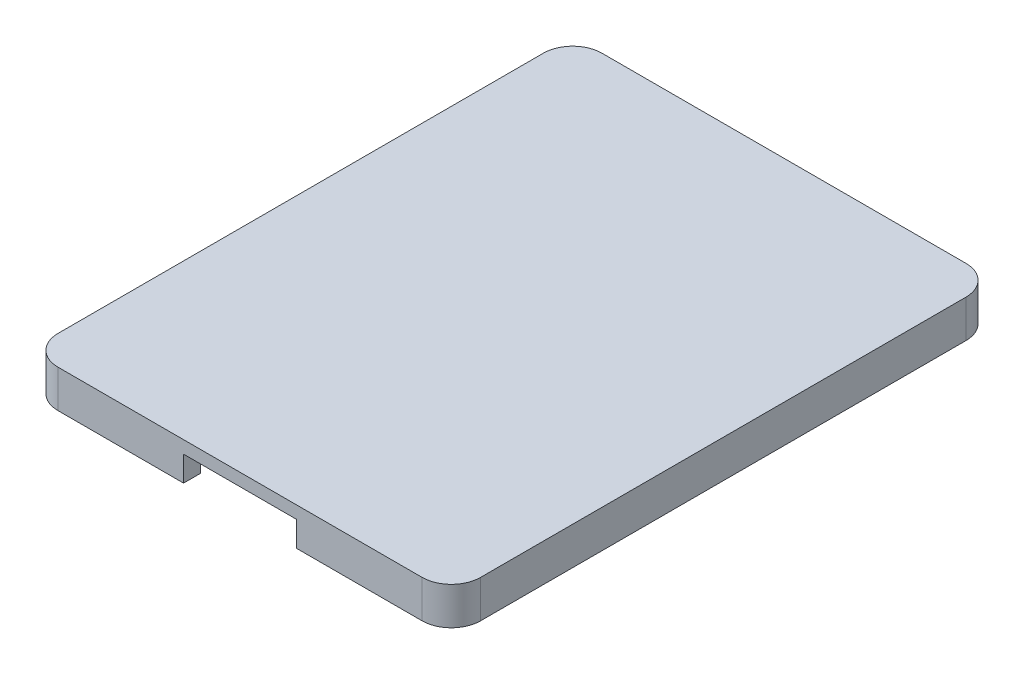
ISO-10303-21;
HEADER;
FILE_DESCRIPTION(('STEP AP214'),'2;1');
FILE_NAME('part.step','',(''),(''),'','','');
FILE_SCHEMA(('AUTOMOTIVE_DESIGN { 1 0 10303 214 1 1 1 1 }'));
ENDSEC;
DATA;
#1=APPLICATION_CONTEXT('core data for automotive mechanical design processes');
#2=APPLICATION_PROTOCOL_DEFINITION('international standard','automotive_design',2000,#1);
#3=PRODUCT_CONTEXT('',#1,'mechanical');
#4=PRODUCT('Part','Part','',(#3));
#5=PRODUCT_RELATED_PRODUCT_CATEGORY('part','',(#4));
#6=PRODUCT_DEFINITION_FORMATION('','',#4);
#7=PRODUCT_DEFINITION_CONTEXT('part definition',#1,'design');
#8=PRODUCT_DEFINITION('design','',#6,#7);
#9=PRODUCT_DEFINITION_SHAPE('','',#8);
#10=(LENGTH_UNIT() NAMED_UNIT(*) SI_UNIT(.MILLI.,.METRE.));
#11=(NAMED_UNIT(*) PLANE_ANGLE_UNIT() SI_UNIT($,.RADIAN.));
#12=(NAMED_UNIT(*) SI_UNIT($,.STERADIAN.) SOLID_ANGLE_UNIT());
#13=UNCERTAINTY_MEASURE_WITH_UNIT(LENGTH_MEASURE(1.E-05),#10,'distance_accuracy_value','');
#14=(GEOMETRIC_REPRESENTATION_CONTEXT(3) GLOBAL_UNCERTAINTY_ASSIGNED_CONTEXT((#13)) GLOBAL_UNIT_ASSIGNED_CONTEXT((#10,
#11,#12)) REPRESENTATION_CONTEXT('',''));
#15=CARTESIAN_POINT('',(0.,0.,0.));
#16=DIRECTION('',(0.,0.,1.));
#17=DIRECTION('',(1.,0.,0.));
#18=AXIS2_PLACEMENT_3D('',#15,#16,#17);
#19=CARTESIAN_POINT('',(-21.75,4.5,29.));
#20=DIRECTION('',(0.,-1.,0.));
#21=DIRECTION('',(0.,0.,-1.));
#22=AXIS2_PLACEMENT_3D('',#19,#20,#21);
#23=CYLINDRICAL_SURFACE('',#22,3.5);
#24=CARTESIAN_POINT('',(-21.75,0.,29.));
#25=DIRECTION('',(0.,1.,0.));
#26=DIRECTION('',(0.,0.,-1.));
#27=AXIS2_PLACEMENT_3D('',#24,#25,#26);
#28=CIRCLE('',#27,3.5);
#29=CARTESIAN_POINT('',(-25.25,0.,29.));
#30=VERTEX_POINT('',#29);
#31=CARTESIAN_POINT('',(-21.75,0.,32.5));
#32=VERTEX_POINT('',#31);
#33=EDGE_CURVE('E245',#30,#32,#28,.T.);
#34=ORIENTED_EDGE('',*,*,#33,.T.);
#35=DIRECTION('',(0.,-1.,0.));
#36=VECTOR('',#35,1.);
#37=CARTESIAN_POINT('',(-21.75,4.5,32.5));
#38=LINE('',#37,#36);
#39=CARTESIAN_POINT('',(-21.75,4.5,32.5));
#40=VERTEX_POINT('',#39);
#41=EDGE_CURVE('E315',#40,#32,#38,.T.);
#42=ORIENTED_EDGE('',*,*,#41,.F.);
#43=CARTESIAN_POINT('',(-21.75,4.5,29.));
#44=DIRECTION('',(0.,1.,0.));
#45=DIRECTION('',(0.,0.,-1.));
#46=AXIS2_PLACEMENT_3D('',#43,#44,#45);
#47=CIRCLE('',#46,3.5);
#48=CARTESIAN_POINT('',(-25.25,4.5,29.));
#49=VERTEX_POINT('',#48);
#50=EDGE_CURVE('E260',#49,#40,#47,.T.);
#51=ORIENTED_EDGE('',*,*,#50,.F.);
#52=DIRECTION('',(0.,-1.,0.));
#53=VECTOR('',#52,1.);
#54=CARTESIAN_POINT('',(-25.25,4.5,29.));
#55=LINE('',#54,#53);
#56=EDGE_CURVE('E278',#49,#30,#55,.T.);
#57=ORIENTED_EDGE('',*,*,#56,.T.);
#58=EDGE_LOOP('',(#34,#42,#51,#57));
#59=FACE_BOUND('',#58,.T.);
#60=ADVANCED_FACE('F33',(#59),#23,.T.);
#61=CARTESIAN_POINT('',(-21.75,4.5,32.5));
#62=DIRECTION('',(0.,0.,-1.));
#63=DIRECTION('',(-1.,0.,0.));
#64=AXIS2_PLACEMENT_3D('',#61,#62,#63);
#65=PLANE('',#64);
#66=DIRECTION('',(-1.,0.,0.));
#67=VECTOR('',#66,1.);
#68=CARTESIAN_POINT('',(-6.75,3.,32.5));
#69=LINE('',#68,#67);
#70=CARTESIAN_POINT('',(6.75,3.,32.5));
#71=VERTEX_POINT('',#70);
#72=CARTESIAN_POINT('',(-6.75,3.,32.5));
#73=VERTEX_POINT('',#72);
#74=EDGE_CURVE('E178',#71,#73,#69,.T.);
#75=ORIENTED_EDGE('',*,*,#74,.F.);
#76=DIRECTION('',(0.,1.,0.));
#77=VECTOR('',#76,1.);
#78=CARTESIAN_POINT('',(6.75,3.,32.5));
#79=LINE('',#78,#77);
#80=CARTESIAN_POINT('',(6.75,0.,32.5));
#81=VERTEX_POINT('',#80);
#82=EDGE_CURVE('E169',#81,#71,#79,.T.);
#83=ORIENTED_EDGE('',*,*,#82,.F.);
#84=DIRECTION('',(1.,0.,0.));
#85=VECTOR('',#84,1.);
#86=CARTESIAN_POINT('',(-21.75,0.,32.5));
#87=LINE('',#86,#85);
#88=CARTESIAN_POINT('',(21.75,0.,32.5));
#89=VERTEX_POINT('',#88);
#90=EDGE_CURVE('E281',#81,#89,#87,.T.);
#91=ORIENTED_EDGE('',*,*,#90,.T.);
#92=DIRECTION('',(0.,-1.,0.));
#93=VECTOR('',#92,1.);
#94=CARTESIAN_POINT('',(21.75,4.5,32.5));
#95=LINE('',#94,#93);
#96=CARTESIAN_POINT('',(21.75,4.5,32.5));
#97=VERTEX_POINT('',#96);
#98=EDGE_CURVE('E312',#97,#89,#95,.T.);
#99=ORIENTED_EDGE('',*,*,#98,.F.);
#100=DIRECTION('',(1.,0.,0.));
#101=VECTOR('',#100,1.);
#102=CARTESIAN_POINT('',(-21.75,4.5,32.5));
#103=LINE('',#102,#101);
#104=EDGE_CURVE('E263',#40,#97,#103,.T.);
#105=ORIENTED_EDGE('',*,*,#104,.F.);
#106=ORIENTED_EDGE('',*,*,#41,.T.);
#107=CARTESIAN_POINT('',(-6.75,0.,32.5));
#108=VERTEX_POINT('',#107);
#109=EDGE_CURVE('E282',#32,#108,#87,.T.);
#110=ORIENTED_EDGE('',*,*,#109,.T.);
#111=DIRECTION('',(0.,-1.,0.));
#112=VECTOR('',#111,1.);
#113=CARTESIAN_POINT('',(-6.75,3.,32.5));
#114=LINE('',#113,#112);
#115=EDGE_CURVE('E184',#73,#108,#114,.T.);
#116=ORIENTED_EDGE('',*,*,#115,.F.);
#117=EDGE_LOOP('',(#75,#83,#91,#99,#105,#106,#110,#116));
#118=FACE_BOUND('',#117,.T.);
#119=ADVANCED_FACE('F186',(#118),#65,.F.);
#120=CARTESIAN_POINT('',(21.75,4.5,29.));
#121=DIRECTION('',(0.,-1.,0.));
#122=DIRECTION('',(0.,0.,-1.));
#123=AXIS2_PLACEMENT_3D('',#120,#121,#122);
#124=CYLINDRICAL_SURFACE('',#123,3.5);
#125=CARTESIAN_POINT('',(21.75,0.,29.));
#126=DIRECTION('',(0.,1.,0.));
#127=DIRECTION('',(0.,0.,1.));
#128=AXIS2_PLACEMENT_3D('',#125,#126,#127);
#129=CIRCLE('',#128,3.5);
#130=CARTESIAN_POINT('',(25.25,0.,29.));
#131=VERTEX_POINT('',#130);
#132=EDGE_CURVE('E284',#89,#131,#129,.T.);
#133=ORIENTED_EDGE('',*,*,#132,.T.);
#134=DIRECTION('',(0.,-1.,0.));
#135=VECTOR('',#134,1.);
#136=CARTESIAN_POINT('',(25.25,4.5,29.));
#137=LINE('',#136,#135);
#138=CARTESIAN_POINT('',(25.25,4.5,29.));
#139=VERTEX_POINT('',#138);
#140=EDGE_CURVE('E309',#139,#131,#137,.T.);
#141=ORIENTED_EDGE('',*,*,#140,.F.);
#142=CARTESIAN_POINT('',(21.75,4.5,29.));
#143=DIRECTION('',(0.,1.,0.));
#144=DIRECTION('',(0.,0.,1.));
#145=AXIS2_PLACEMENT_3D('',#142,#143,#144);
#146=CIRCLE('',#145,3.5);
#147=EDGE_CURVE('E266',#97,#139,#146,.T.);
#148=ORIENTED_EDGE('',*,*,#147,.F.);
#149=ORIENTED_EDGE('',*,*,#98,.T.);
#150=EDGE_LOOP('',(#133,#141,#148,#149));
#151=FACE_BOUND('',#150,.T.);
#152=ADVANCED_FACE('F348',(#151),#124,.T.);
#153=CARTESIAN_POINT('',(25.25,4.5,29.));
#154=DIRECTION('',(-1.,0.,0.));
#155=DIRECTION('',(0.,0.,1.));
#156=AXIS2_PLACEMENT_3D('',#153,#154,#155);
#157=PLANE('',#156);
#158=DIRECTION('',(0.,0.,-1.));
#159=VECTOR('',#158,1.);
#160=CARTESIAN_POINT('',(25.25,0.,29.));
#161=LINE('',#160,#159);
#162=CARTESIAN_POINT('',(25.25,0.,-29.));
#163=VERTEX_POINT('',#162);
#164=EDGE_CURVE('E286',#131,#163,#161,.T.);
#165=ORIENTED_EDGE('',*,*,#164,.T.);
#166=DIRECTION('',(0.,-1.,0.));
#167=VECTOR('',#166,1.);
#168=CARTESIAN_POINT('',(25.25,4.5,-29.));
#169=LINE('',#168,#167);
#170=CARTESIAN_POINT('',(25.25,4.5,-29.));
#171=VERTEX_POINT('',#170);
#172=EDGE_CURVE('E306',#171,#163,#169,.T.);
#173=ORIENTED_EDGE('',*,*,#172,.F.);
#174=DIRECTION('',(0.,0.,-1.));
#175=VECTOR('',#174,1.);
#176=CARTESIAN_POINT('',(25.25,4.5,29.));
#177=LINE('',#176,#175);
#178=EDGE_CURVE('E268',#139,#171,#177,.T.);
#179=ORIENTED_EDGE('',*,*,#178,.F.);
#180=ORIENTED_EDGE('',*,*,#140,.T.);
#181=EDGE_LOOP('',(#165,#173,#179,#180));
#182=FACE_BOUND('',#181,.T.);
#183=ADVANCED_FACE('F379',(#182),#157,.F.);
#184=CARTESIAN_POINT('',(21.75,4.5,-29.));
#185=DIRECTION('',(0.,-1.,0.));
#186=DIRECTION('',(0.,0.,-1.));
#187=AXIS2_PLACEMENT_3D('',#184,#185,#186);
#188=CYLINDRICAL_SURFACE('',#187,3.5);
#189=CARTESIAN_POINT('',(21.75,0.,-29.));
#190=DIRECTION('',(0.,1.,0.));
#191=DIRECTION('',(0.,0.,-1.));
#192=AXIS2_PLACEMENT_3D('',#189,#190,#191);
#193=CIRCLE('',#192,3.5);
#194=CARTESIAN_POINT('',(21.75,0.,-32.5));
#195=VERTEX_POINT('',#194);
#196=EDGE_CURVE('E288',#163,#195,#193,.T.);
#197=ORIENTED_EDGE('',*,*,#196,.T.);
#198=DIRECTION('',(0.,-1.,0.));
#199=VECTOR('',#198,1.);
#200=CARTESIAN_POINT('',(21.75,4.5,-32.5));
#201=LINE('',#200,#199);
#202=CARTESIAN_POINT('',(21.75,4.5,-32.5));
#203=VERTEX_POINT('',#202);
#204=EDGE_CURVE('E303',#203,#195,#201,.T.);
#205=ORIENTED_EDGE('',*,*,#204,.F.);
#206=CARTESIAN_POINT('',(21.75,4.5,-29.));
#207=DIRECTION('',(0.,1.,0.));
#208=DIRECTION('',(0.,0.,-1.));
#209=AXIS2_PLACEMENT_3D('',#206,#207,#208);
#210=CIRCLE('',#209,3.5);
#211=EDGE_CURVE('E270',#171,#203,#210,.T.);
#212=ORIENTED_EDGE('',*,*,#211,.F.);
#213=ORIENTED_EDGE('',*,*,#172,.T.);
#214=EDGE_LOOP('',(#197,#205,#212,#213));
#215=FACE_BOUND('',#214,.T.);
#216=ADVANCED_FACE('F376',(#215),#188,.T.);
#217=CARTESIAN_POINT('',(-21.75,4.5,-32.5));
#218=DIRECTION('',(0.,0.,1.));
#219=DIRECTION('',(1.,0.,0.));
#220=AXIS2_PLACEMENT_3D('',#217,#218,#219);
#221=PLANE('',#220);
#222=DIRECTION('',(-1.,0.,0.));
#223=VECTOR('',#222,1.);
#224=CARTESIAN_POINT('',(-21.75,0.,-32.5));
#225=LINE('',#224,#223);
#226=CARTESIAN_POINT('',(-21.75,0.,-32.5));
#227=VERTEX_POINT('',#226);
#228=EDGE_CURVE('E290',#195,#227,#225,.T.);
#229=ORIENTED_EDGE('',*,*,#228,.T.);
#230=DIRECTION('',(0.,-1.,0.));
#231=VECTOR('',#230,1.);
#232=CARTESIAN_POINT('',(-21.75,4.5,-32.5));
#233=LINE('',#232,#231);
#234=CARTESIAN_POINT('',(-21.75,4.5,-32.5));
#235=VERTEX_POINT('',#234);
#236=EDGE_CURVE('E300',#235,#227,#233,.T.);
#237=ORIENTED_EDGE('',*,*,#236,.F.);
#238=DIRECTION('',(-1.,0.,0.));
#239=VECTOR('',#238,1.);
#240=CARTESIAN_POINT('',(-21.75,4.5,-32.5));
#241=LINE('',#240,#239);
#242=EDGE_CURVE('E272',#203,#235,#241,.T.);
#243=ORIENTED_EDGE('',*,*,#242,.F.);
#244=ORIENTED_EDGE('',*,*,#204,.T.);
#245=EDGE_LOOP('',(#229,#237,#243,#244));
#246=FACE_BOUND('',#245,.T.);
#247=ADVANCED_FACE('F372',(#246),#221,.F.);
#248=CARTESIAN_POINT('',(-21.75,4.5,-29.));
#249=DIRECTION('',(0.,-1.,0.));
#250=DIRECTION('',(0.,0.,-1.));
#251=AXIS2_PLACEMENT_3D('',#248,#249,#250);
#252=CYLINDRICAL_SURFACE('',#251,3.5);
#253=CARTESIAN_POINT('',(-21.75,0.,-29.));
#254=DIRECTION('',(0.,1.,0.));
#255=DIRECTION('',(0.,0.,-1.));
#256=AXIS2_PLACEMENT_3D('',#253,#254,#255);
#257=CIRCLE('',#256,3.5);
#258=CARTESIAN_POINT('',(-25.25,0.,-29.));
#259=VERTEX_POINT('',#258);
#260=EDGE_CURVE('E292',#227,#259,#257,.T.);
#261=ORIENTED_EDGE('',*,*,#260,.T.);
#262=DIRECTION('',(0.,-1.,0.));
#263=VECTOR('',#262,1.);
#264=CARTESIAN_POINT('',(-25.25,4.5,-29.));
#265=LINE('',#264,#263);
#266=CARTESIAN_POINT('',(-25.25,4.5,-29.));
#267=VERTEX_POINT('',#266);
#268=EDGE_CURVE('E297',#267,#259,#265,.T.);
#269=ORIENTED_EDGE('',*,*,#268,.F.);
#270=CARTESIAN_POINT('',(-21.75,4.5,-29.));
#271=DIRECTION('',(0.,1.,0.));
#272=DIRECTION('',(0.,0.,-1.));
#273=AXIS2_PLACEMENT_3D('',#270,#271,#272);
#274=CIRCLE('',#273,3.5);
#275=EDGE_CURVE('E274',#235,#267,#274,.T.);
#276=ORIENTED_EDGE('',*,*,#275,.F.);
#277=ORIENTED_EDGE('',*,*,#236,.T.);
#278=EDGE_LOOP('',(#261,#269,#276,#277));
#279=FACE_BOUND('',#278,.T.);
#280=ADVANCED_FACE('F368',(#279),#252,.T.);
#281=CARTESIAN_POINT('',(-25.25,4.5,29.));
#282=DIRECTION('',(1.,0.,0.));
#283=DIRECTION('',(0.,0.,-1.));
#284=AXIS2_PLACEMENT_3D('',#281,#282,#283);
#285=PLANE('',#284);
#286=DIRECTION('',(0.,0.,1.));
#287=VECTOR('',#286,1.);
#288=CARTESIAN_POINT('',(-25.25,0.,29.));
#289=LINE('',#288,#287);
#290=EDGE_CURVE('E264',#259,#30,#289,.T.);
#291=ORIENTED_EDGE('',*,*,#290,.T.);
#292=ORIENTED_EDGE('',*,*,#56,.F.);
#293=DIRECTION('',(0.,0.,1.));
#294=VECTOR('',#293,1.);
#295=CARTESIAN_POINT('',(-25.25,4.5,29.));
#296=LINE('',#295,#294);
#297=EDGE_CURVE('E276',#267,#49,#296,.T.);
#298=ORIENTED_EDGE('',*,*,#297,.F.);
#299=ORIENTED_EDGE('',*,*,#268,.T.);
#300=EDGE_LOOP('',(#291,#292,#298,#299));
#301=FACE_BOUND('',#300,.T.);
#302=ADVANCED_FACE('F363',(#301),#285,.F.);
#303=CARTESIAN_POINT('',(-21.75,4.5,29.));
#304=DIRECTION('',(0.,-1.,0.));
#305=DIRECTION('',(0.,0.,-1.));
#306=AXIS2_PLACEMENT_3D('',#303,#304,#305);
#307=PLANE('',#306);
#308=ORIENTED_EDGE('',*,*,#50,.T.);
#309=ORIENTED_EDGE('',*,*,#104,.T.);
#310=ORIENTED_EDGE('',*,*,#147,.T.);
#311=ORIENTED_EDGE('',*,*,#178,.T.);
#312=ORIENTED_EDGE('',*,*,#211,.T.);
#313=ORIENTED_EDGE('',*,*,#242,.T.);
#314=ORIENTED_EDGE('',*,*,#275,.T.);
#315=ORIENTED_EDGE('',*,*,#297,.T.);
#316=EDGE_LOOP('',(#308,#309,#310,#311,#312,#313,#314,#315));
#317=FACE_BOUND('',#316,.T.);
#318=ADVANCED_FACE('F352',(#317),#307,.F.);
#319=CARTESIAN_POINT('',(-21.75,0.,29.));
#320=DIRECTION('',(0.,-1.,0.));
#321=DIRECTION('',(0.,0.,-1.));
#322=AXIS2_PLACEMENT_3D('',#319,#320,#321);
#323=PLANE('',#322);
#324=DIRECTION('',(0.,0.,1.));
#325=VECTOR('',#324,1.);
#326=CARTESIAN_POINT('',(6.75,0.,29.));
#327=LINE('',#326,#325);
#328=CARTESIAN_POINT('',(6.75,0.,30.5));
#329=VERTEX_POINT('',#328);
#330=EDGE_CURVE('E174',#329,#81,#327,.T.);
#331=ORIENTED_EDGE('',*,*,#330,.F.);
#332=DIRECTION('',(-1.,0.,0.));
#333=VECTOR('',#332,1.);
#334=CARTESIAN_POINT('',(-19.75,0.,30.5));
#335=LINE('',#334,#333);
#336=CARTESIAN_POINT('',(19.75,0.,30.5));
#337=VERTEX_POINT('',#336);
#338=EDGE_CURVE('E229',#337,#329,#335,.T.);
#339=ORIENTED_EDGE('',*,*,#338,.F.);
#340=CARTESIAN_POINT('',(19.75,0.,27.));
#341=DIRECTION('',(0.,-1.,0.));
#342=DIRECTION('',(0.,0.,1.));
#343=AXIS2_PLACEMENT_3D('',#340,#341,#342);
#344=CIRCLE('',#343,3.5);
#345=CARTESIAN_POINT('',(23.25,0.,27.));
#346=VERTEX_POINT('',#345);
#347=EDGE_CURVE('E225',#346,#337,#344,.T.);
#348=ORIENTED_EDGE('',*,*,#347,.F.);
#349=DIRECTION('',(0.,0.,1.));
#350=VECTOR('',#349,1.);
#351=CARTESIAN_POINT('',(23.25,0.,-27.));
#352=LINE('',#351,#350);
#353=CARTESIAN_POINT('',(23.25,0.,-27.));
#354=VERTEX_POINT('',#353);
#355=EDGE_CURVE('E222',#354,#346,#352,.T.);
#356=ORIENTED_EDGE('',*,*,#355,.F.);
#357=CARTESIAN_POINT('',(19.75,0.,-27.));
#358=DIRECTION('',(0.,-1.,0.));
#359=DIRECTION('',(0.,0.,-1.));
#360=AXIS2_PLACEMENT_3D('',#357,#358,#359);
#361=CIRCLE('',#360,3.5);
#362=CARTESIAN_POINT('',(19.75,0.,-30.5));
#363=VERTEX_POINT('',#362);
#364=EDGE_CURVE('E55',#363,#354,#361,.T.);
#365=ORIENTED_EDGE('',*,*,#364,.F.);
#366=DIRECTION('',(1.,0.,0.));
#367=VECTOR('',#366,1.);
#368=CARTESIAN_POINT('',(-19.75,0.,-30.5));
#369=LINE('',#368,#367);
#370=CARTESIAN_POINT('',(-19.75,0.,-30.5));
#371=VERTEX_POINT('',#370);
#372=EDGE_CURVE('E199',#371,#363,#369,.T.);
#373=ORIENTED_EDGE('',*,*,#372,.F.);
#374=CARTESIAN_POINT('',(-19.75,0.,-27.));
#375=DIRECTION('',(0.,-1.,0.));
#376=DIRECTION('',(0.,0.,1.));
#377=AXIS2_PLACEMENT_3D('',#374,#375,#376);
#378=CIRCLE('',#377,3.5);
#379=CARTESIAN_POINT('',(-23.25,0.,-27.));
#380=VERTEX_POINT('',#379);
#381=EDGE_CURVE('E238',#380,#371,#378,.T.);
#382=ORIENTED_EDGE('',*,*,#381,.F.);
#383=DIRECTION('',(0.,0.,-1.));
#384=VECTOR('',#383,1.);
#385=CARTESIAN_POINT('',(-23.25,0.,-27.));
#386=LINE('',#385,#384);
#387=CARTESIAN_POINT('',(-23.25,0.,27.));
#388=VERTEX_POINT('',#387);
#389=EDGE_CURVE('E235',#388,#380,#386,.T.);
#390=ORIENTED_EDGE('',*,*,#389,.F.);
#391=CARTESIAN_POINT('',(-19.75,0.,27.));
#392=DIRECTION('',(0.,-1.,0.));
#393=DIRECTION('',(0.,0.,1.));
#394=AXIS2_PLACEMENT_3D('',#391,#392,#393);
#395=CIRCLE('',#394,3.5);
#396=CARTESIAN_POINT('',(-19.75,0.,30.5));
#397=VERTEX_POINT('',#396);
#398=EDGE_CURVE('E232',#397,#388,#395,.T.);
#399=ORIENTED_EDGE('',*,*,#398,.F.);
#400=CARTESIAN_POINT('',(-6.75,0.,30.5));
#401=VERTEX_POINT('',#400);
#402=EDGE_CURVE('E228',#401,#397,#335,.T.);
#403=ORIENTED_EDGE('',*,*,#402,.F.);
#404=DIRECTION('',(0.,0.,-1.));
#405=VECTOR('',#404,1.);
#406=CARTESIAN_POINT('',(-6.75,0.,29.));
#407=LINE('',#406,#405);
#408=EDGE_CURVE('E191',#108,#401,#407,.T.);
#409=ORIENTED_EDGE('',*,*,#408,.F.);
#410=ORIENTED_EDGE('',*,*,#109,.F.);
#411=ORIENTED_EDGE('',*,*,#33,.F.);
#412=ORIENTED_EDGE('',*,*,#290,.F.);
#413=ORIENTED_EDGE('',*,*,#260,.F.);
#414=ORIENTED_EDGE('',*,*,#228,.F.);
#415=ORIENTED_EDGE('',*,*,#196,.F.);
#416=ORIENTED_EDGE('',*,*,#164,.F.);
#417=ORIENTED_EDGE('',*,*,#132,.F.);
#418=ORIENTED_EDGE('',*,*,#90,.F.);
#419=EDGE_LOOP('',(#331,#339,#348,#356,#365,#373,#382,#390,#399,#403,#409,#410,#411,#412,#413,
#414,#415,#416,#417,#418));
#420=FACE_BOUND('',#419,.T.);
#421=ADVANCED_FACE('F326',(#420),#323,.T.);
#422=CARTESIAN_POINT('',(19.75,4.,-27.));
#423=DIRECTION('',(0.,-1.,0.));
#424=DIRECTION('',(0.,0.,-1.));
#425=AXIS2_PLACEMENT_3D('',#422,#423,#424);
#426=CYLINDRICAL_SURFACE('',#425,3.5);
#427=ORIENTED_EDGE('',*,*,#364,.T.);
#428=DIRECTION('',(0.,-1.,0.));
#429=VECTOR('',#428,1.);
#430=CARTESIAN_POINT('',(23.25,4.,-27.));
#431=LINE('',#430,#429);
#432=CARTESIAN_POINT('',(23.25,4.,-27.));
#433=VERTEX_POINT('',#432);
#434=EDGE_CURVE('E220',#433,#354,#431,.T.);
#435=ORIENTED_EDGE('',*,*,#434,.F.);
#436=CARTESIAN_POINT('',(19.75,4.,-27.));
#437=DIRECTION('',(0.,-1.,0.));
#438=DIRECTION('',(0.,0.,-1.));
#439=AXIS2_PLACEMENT_3D('',#436,#437,#438);
#440=CIRCLE('',#439,3.5);
#441=CARTESIAN_POINT('',(19.75,4.,-30.5));
#442=VERTEX_POINT('',#441);
#443=EDGE_CURVE('E195',#442,#433,#440,.T.);
#444=ORIENTED_EDGE('',*,*,#443,.F.);
#445=DIRECTION('',(0.,-1.,0.));
#446=VECTOR('',#445,1.);
#447=CARTESIAN_POINT('',(19.75,4.,-30.5));
#448=LINE('',#447,#446);
#449=EDGE_CURVE('E243',#442,#363,#448,.T.);
#450=ORIENTED_EDGE('',*,*,#449,.T.);
#451=EDGE_LOOP('',(#427,#435,#444,#450));
#452=FACE_BOUND('',#451,.T.);
#453=ADVANCED_FACE('F451',(#452),#426,.F.);
#454=CARTESIAN_POINT('',(-19.75,4.,-30.5));
#455=DIRECTION('',(0.,0.,-1.));
#456=DIRECTION('',(-1.,0.,0.));
#457=AXIS2_PLACEMENT_3D('',#454,#455,#456);
#458=PLANE('',#457);
#459=ORIENTED_EDGE('',*,*,#372,.T.);
#460=ORIENTED_EDGE('',*,*,#449,.F.);
#461=DIRECTION('',(1.,0.,0.));
#462=VECTOR('',#461,1.);
#463=CARTESIAN_POINT('',(-19.75,4.,-30.5));
#464=LINE('',#463,#462);
#465=CARTESIAN_POINT('',(-19.75,4.,-30.5));
#466=VERTEX_POINT('',#465);
#467=EDGE_CURVE('E217',#466,#442,#464,.T.);
#468=ORIENTED_EDGE('',*,*,#467,.F.);
#469=DIRECTION('',(0.,-1.,0.));
#470=VECTOR('',#469,1.);
#471=CARTESIAN_POINT('',(-19.75,4.,-30.5));
#472=LINE('',#471,#470);
#473=EDGE_CURVE('E246',#466,#371,#472,.T.);
#474=ORIENTED_EDGE('',*,*,#473,.T.);
#475=EDGE_LOOP('',(#459,#460,#468,#474));
#476=FACE_BOUND('',#475,.T.);
#477=ADVANCED_FACE('F456',(#476),#458,.F.);
#478=CARTESIAN_POINT('',(-19.75,4.,-27.));
#479=DIRECTION('',(0.,-1.,0.));
#480=DIRECTION('',(0.,0.,-1.));
#481=AXIS2_PLACEMENT_3D('',#478,#479,#480);
#482=CYLINDRICAL_SURFACE('',#481,3.5);
#483=ORIENTED_EDGE('',*,*,#381,.T.);
#484=ORIENTED_EDGE('',*,*,#473,.F.);
#485=CARTESIAN_POINT('',(-19.75,4.,-27.));
#486=DIRECTION('',(0.,-1.,0.));
#487=DIRECTION('',(0.,0.,1.));
#488=AXIS2_PLACEMENT_3D('',#485,#486,#487);
#489=CIRCLE('',#488,3.5);
#490=CARTESIAN_POINT('',(-23.25,4.,-27.));
#491=VERTEX_POINT('',#490);
#492=EDGE_CURVE('E214',#491,#466,#489,.T.);
#493=ORIENTED_EDGE('',*,*,#492,.F.);
#494=DIRECTION('',(0.,-1.,0.));
#495=VECTOR('',#494,1.);
#496=CARTESIAN_POINT('',(-23.25,4.,-27.));
#497=LINE('',#496,#495);
#498=EDGE_CURVE('E248',#491,#380,#497,.T.);
#499=ORIENTED_EDGE('',*,*,#498,.T.);
#500=EDGE_LOOP('',(#483,#484,#493,#499));
#501=FACE_BOUND('',#500,.T.);
#502=ADVANCED_FACE('F465',(#501),#482,.F.);
#503=CARTESIAN_POINT('',(-23.25,4.,-27.));
#504=DIRECTION('',(-1.,0.,0.));
#505=DIRECTION('',(0.,0.,1.));
#506=AXIS2_PLACEMENT_3D('',#503,#504,#505);
#507=PLANE('',#506);
#508=ORIENTED_EDGE('',*,*,#389,.T.);
#509=ORIENTED_EDGE('',*,*,#498,.F.);
#510=DIRECTION('',(0.,0.,-1.));
#511=VECTOR('',#510,1.);
#512=CARTESIAN_POINT('',(-23.25,4.,-27.));
#513=LINE('',#512,#511);
#514=CARTESIAN_POINT('',(-23.25,4.,27.));
#515=VERTEX_POINT('',#514);
#516=EDGE_CURVE('E211',#515,#491,#513,.T.);
#517=ORIENTED_EDGE('',*,*,#516,.F.);
#518=DIRECTION('',(0.,-1.,0.));
#519=VECTOR('',#518,1.);
#520=CARTESIAN_POINT('',(-23.25,4.,27.));
#521=LINE('',#520,#519);
#522=EDGE_CURVE('E250',#515,#388,#521,.T.);
#523=ORIENTED_EDGE('',*,*,#522,.T.);
#524=EDGE_LOOP('',(#508,#509,#517,#523));
#525=FACE_BOUND('',#524,.T.);
#526=ADVANCED_FACE('F475',(#525),#507,.F.);
#527=CARTESIAN_POINT('',(-19.75,4.,27.));
#528=DIRECTION('',(0.,-1.,0.));
#529=DIRECTION('',(0.,0.,-1.));
#530=AXIS2_PLACEMENT_3D('',#527,#528,#529);
#531=CYLINDRICAL_SURFACE('',#530,3.5);
#532=ORIENTED_EDGE('',*,*,#398,.T.);
#533=ORIENTED_EDGE('',*,*,#522,.F.);
#534=CARTESIAN_POINT('',(-19.75,4.,27.));
#535=DIRECTION('',(0.,-1.,0.));
#536=DIRECTION('',(0.,0.,1.));
#537=AXIS2_PLACEMENT_3D('',#534,#535,#536);
#538=CIRCLE('',#537,3.5);
#539=CARTESIAN_POINT('',(-19.75,4.,30.5));
#540=VERTEX_POINT('',#539);
#541=EDGE_CURVE('E208',#540,#515,#538,.T.);
#542=ORIENTED_EDGE('',*,*,#541,.F.);
#543=DIRECTION('',(0.,-1.,0.));
#544=VECTOR('',#543,1.);
#545=CARTESIAN_POINT('',(-19.75,4.,30.5));
#546=LINE('',#545,#544);
#547=EDGE_CURVE('E252',#540,#397,#546,.T.);
#548=ORIENTED_EDGE('',*,*,#547,.T.);
#549=EDGE_LOOP('',(#532,#533,#542,#548));
#550=FACE_BOUND('',#549,.T.);
#551=ADVANCED_FACE('F330',(#550),#531,.F.);
#552=CARTESIAN_POINT('',(-19.75,4.,30.5));
#553=DIRECTION('',(0.,0.,1.));
#554=DIRECTION('',(1.,0.,0.));
#555=AXIS2_PLACEMENT_3D('',#552,#553,#554);
#556=PLANE('',#555);
#557=ORIENTED_EDGE('',*,*,#338,.T.);
#558=DIRECTION('',(0.,1.,0.));
#559=VECTOR('',#558,1.);
#560=CARTESIAN_POINT('',(6.75,4.,30.5));
#561=LINE('',#560,#559);
#562=CARTESIAN_POINT('',(6.75,3.,30.5));
#563=VERTEX_POINT('',#562);
#564=EDGE_CURVE('E11',#329,#563,#561,.T.);
#565=ORIENTED_EDGE('',*,*,#564,.T.);
#566=DIRECTION('',(-1.,0.,0.));
#567=VECTOR('',#566,1.);
#568=CARTESIAN_POINT('',(-19.75,3.,30.5));
#569=LINE('',#568,#567);
#570=CARTESIAN_POINT('',(-6.75,3.,30.5));
#571=VERTEX_POINT('',#570);
#572=EDGE_CURVE('E183',#563,#571,#569,.T.);
#573=ORIENTED_EDGE('',*,*,#572,.T.);
#574=DIRECTION('',(0.,-1.,0.));
#575=VECTOR('',#574,1.);
#576=CARTESIAN_POINT('',(-6.75,4.,30.5));
#577=LINE('',#576,#575);
#578=EDGE_CURVE('E40',#571,#401,#577,.T.);
#579=ORIENTED_EDGE('',*,*,#578,.T.);
#580=ORIENTED_EDGE('',*,*,#402,.T.);
#581=ORIENTED_EDGE('',*,*,#547,.F.);
#582=DIRECTION('',(-1.,0.,0.));
#583=VECTOR('',#582,1.);
#584=CARTESIAN_POINT('',(-19.75,4.,30.5));
#585=LINE('',#584,#583);
#586=CARTESIAN_POINT('',(19.75,4.,30.5));
#587=VERTEX_POINT('',#586);
#588=EDGE_CURVE('E205',#587,#540,#585,.T.);
#589=ORIENTED_EDGE('',*,*,#588,.F.);
#590=DIRECTION('',(0.,-1.,0.));
#591=VECTOR('',#590,1.);
#592=CARTESIAN_POINT('',(19.75,4.,30.5));
#593=LINE('',#592,#591);
#594=EDGE_CURVE('E255',#587,#337,#593,.T.);
#595=ORIENTED_EDGE('',*,*,#594,.T.);
#596=EDGE_LOOP('',(#557,#565,#573,#579,#580,#581,#589,#595));
#597=FACE_BOUND('',#596,.T.);
#598=ADVANCED_FACE('F321',(#597),#556,.F.);
#599=CARTESIAN_POINT('',(19.75,4.,27.));
#600=DIRECTION('',(0.,-1.,0.));
#601=DIRECTION('',(0.,0.,-1.));
#602=AXIS2_PLACEMENT_3D('',#599,#600,#601);
#603=CYLINDRICAL_SURFACE('',#602,3.5);
#604=ORIENTED_EDGE('',*,*,#347,.T.);
#605=ORIENTED_EDGE('',*,*,#594,.F.);
#606=CARTESIAN_POINT('',(19.75,4.,27.));
#607=DIRECTION('',(0.,-1.,0.));
#608=DIRECTION('',(0.,0.,1.));
#609=AXIS2_PLACEMENT_3D('',#606,#607,#608);
#610=CIRCLE('',#609,3.5);
#611=CARTESIAN_POINT('',(23.25,4.,27.));
#612=VERTEX_POINT('',#611);
#613=EDGE_CURVE('E202',#612,#587,#610,.T.);
#614=ORIENTED_EDGE('',*,*,#613,.F.);
#615=DIRECTION('',(0.,-1.,0.));
#616=VECTOR('',#615,1.);
#617=CARTESIAN_POINT('',(23.25,4.,27.));
#618=LINE('',#617,#616);
#619=EDGE_CURVE('E257',#612,#346,#618,.T.);
#620=ORIENTED_EDGE('',*,*,#619,.T.);
#621=EDGE_LOOP('',(#604,#605,#614,#620));
#622=FACE_BOUND('',#621,.T.);
#623=ADVANCED_FACE('F339',(#622),#603,.F.);
#624=CARTESIAN_POINT('',(23.25,4.,-27.));
#625=DIRECTION('',(1.,0.,0.));
#626=DIRECTION('',(0.,0.,-1.));
#627=AXIS2_PLACEMENT_3D('',#624,#625,#626);
#628=PLANE('',#627);
#629=ORIENTED_EDGE('',*,*,#355,.T.);
#630=ORIENTED_EDGE('',*,*,#619,.F.);
#631=DIRECTION('',(0.,0.,1.));
#632=VECTOR('',#631,1.);
#633=CARTESIAN_POINT('',(23.25,4.,-27.));
#634=LINE('',#633,#632);
#635=EDGE_CURVE('E198',#433,#612,#634,.T.);
#636=ORIENTED_EDGE('',*,*,#635,.F.);
#637=ORIENTED_EDGE('',*,*,#434,.T.);
#638=EDGE_LOOP('',(#629,#630,#636,#637));
#639=FACE_BOUND('',#638,.T.);
#640=ADVANCED_FACE('F504',(#639),#628,.F.);
#641=CARTESIAN_POINT('',(19.75,4.,-27.));
#642=DIRECTION('',(0.,-1.,0.));
#643=DIRECTION('',(0.,0.,-1.));
#644=AXIS2_PLACEMENT_3D('',#641,#642,#643);
#645=PLANE('',#644);
#646=ORIENTED_EDGE('',*,*,#443,.T.);
#647=ORIENTED_EDGE('',*,*,#635,.T.);
#648=ORIENTED_EDGE('',*,*,#613,.T.);
#649=ORIENTED_EDGE('',*,*,#588,.T.);
#650=ORIENTED_EDGE('',*,*,#541,.T.);
#651=ORIENTED_EDGE('',*,*,#516,.T.);
#652=ORIENTED_EDGE('',*,*,#492,.T.);
#653=ORIENTED_EDGE('',*,*,#467,.T.);
#654=EDGE_LOOP('',(#646,#647,#648,#649,#650,#651,#652,#653));
#655=FACE_BOUND('',#654,.T.);
#656=ADVANCED_FACE('F336',(#655),#645,.T.);
#657=CARTESIAN_POINT('',(-6.75,3.,17.5));
#658=DIRECTION('',(0.,1.,0.));
#659=DIRECTION('',(0.,0.,1.));
#660=AXIS2_PLACEMENT_3D('',#657,#658,#659);
#661=PLANE('',#660);
#662=DIRECTION('',(0.,0.,1.));
#663=VECTOR('',#662,1.);
#664=CARTESIAN_POINT('',(6.75,3.,17.5));
#665=LINE('',#664,#663);
#666=EDGE_CURVE('E172',#563,#71,#665,.T.);
#667=ORIENTED_EDGE('',*,*,#666,.T.);
#668=ORIENTED_EDGE('',*,*,#74,.T.);
#669=DIRECTION('',(0.,0.,1.));
#670=VECTOR('',#669,1.);
#671=CARTESIAN_POINT('',(-6.75,3.,17.5));
#672=LINE('',#671,#670);
#673=EDGE_CURVE('E47',#571,#73,#672,.T.);
#674=ORIENTED_EDGE('',*,*,#673,.F.);
#675=ORIENTED_EDGE('',*,*,#572,.F.);
#676=EDGE_LOOP('',(#667,#668,#674,#675));
#677=FACE_BOUND('',#676,.T.);
#678=ADVANCED_FACE('F180',(#677),#661,.F.);
#679=CARTESIAN_POINT('',(6.75,3.,17.5));
#680=DIRECTION('',(1.,0.,0.));
#681=DIRECTION('',(0.,0.,-1.));
#682=AXIS2_PLACEMENT_3D('',#679,#680,#681);
#683=PLANE('',#682);
#684=ORIENTED_EDGE('',*,*,#330,.T.);
#685=ORIENTED_EDGE('',*,*,#82,.T.);
#686=ORIENTED_EDGE('',*,*,#666,.F.);
#687=ORIENTED_EDGE('',*,*,#564,.F.);
#688=EDGE_LOOP('',(#684,#685,#686,#687));
#689=FACE_BOUND('',#688,.T.);
#690=ADVANCED_FACE('F171',(#689),#683,.F.);
#691=CARTESIAN_POINT('',(-6.75,3.,17.5));
#692=DIRECTION('',(-1.,0.,0.));
#693=DIRECTION('',(0.,0.,1.));
#694=AXIS2_PLACEMENT_3D('',#691,#692,#693);
#695=PLANE('',#694);
#696=ORIENTED_EDGE('',*,*,#408,.T.);
#697=ORIENTED_EDGE('',*,*,#578,.F.);
#698=ORIENTED_EDGE('',*,*,#673,.T.);
#699=ORIENTED_EDGE('',*,*,#115,.T.);
#700=EDGE_LOOP('',(#696,#697,#698,#699));
#701=FACE_BOUND('',#700,.T.);
#702=ADVANCED_FACE('F535',(#701),#695,.F.);
#703=CLOSED_SHELL('',(#60,#119,#152,#183,#216,#247,#280,#302,#318,#421,#453,#477,#502,#526,#551,
#598,#623,#640,#656,#678,#690,#702));
#704=MANIFOLD_SOLID_BREP('B2',#703);
#705=ADVANCED_BREP_SHAPE_REPRESENTATION('',(#18,#704),#14);
#706=SHAPE_DEFINITION_REPRESENTATION(#9,#705);
ENDSEC;
END-ISO-10303-21;
